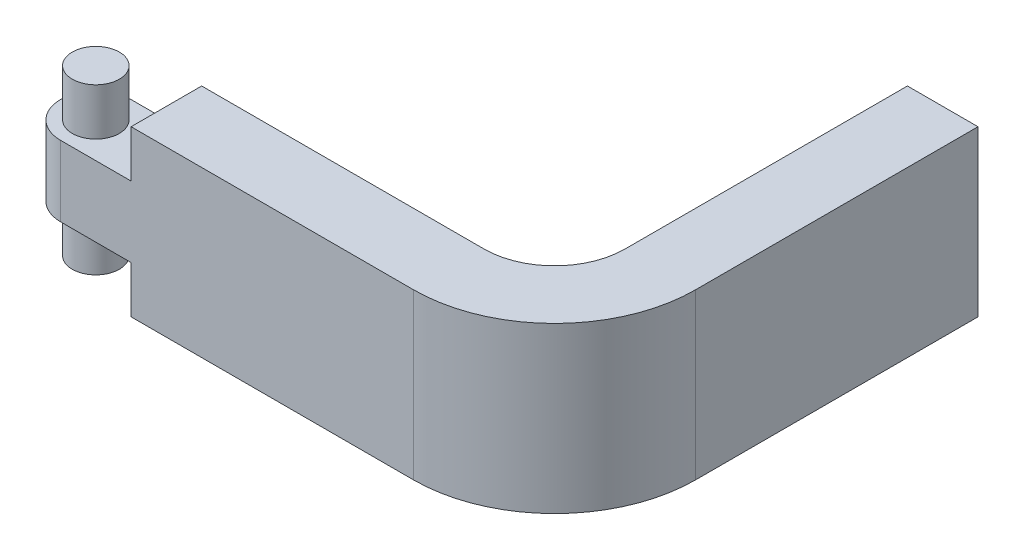
ISO-10303-21;
HEADER;
FILE_DESCRIPTION(('STEP AP214'),'2;1');
FILE_NAME('part.step','',(''),(''),'','','');
FILE_SCHEMA(('AUTOMOTIVE_DESIGN { 1 0 10303 214 1 1 1 1 }'));
ENDSEC;
DATA;
#1=APPLICATION_CONTEXT('core data for automotive mechanical design processes');
#2=APPLICATION_PROTOCOL_DEFINITION('international standard','automotive_design',2000,#1);
#3=PRODUCT_CONTEXT('',#1,'mechanical');
#4=PRODUCT('Part','Part','',(#3));
#5=PRODUCT_RELATED_PRODUCT_CATEGORY('part','',(#4));
#6=PRODUCT_DEFINITION_FORMATION('','',#4);
#7=PRODUCT_DEFINITION_CONTEXT('part definition',#1,'design');
#8=PRODUCT_DEFINITION('design','',#6,#7);
#9=PRODUCT_DEFINITION_SHAPE('','',#8);
#10=(LENGTH_UNIT() NAMED_UNIT(*) SI_UNIT(.MILLI.,.METRE.));
#11=(NAMED_UNIT(*) PLANE_ANGLE_UNIT() SI_UNIT($,.RADIAN.));
#12=(NAMED_UNIT(*) SI_UNIT($,.STERADIAN.) SOLID_ANGLE_UNIT());
#13=UNCERTAINTY_MEASURE_WITH_UNIT(LENGTH_MEASURE(1.E-05),#10,'distance_accuracy_value','');
#14=(GEOMETRIC_REPRESENTATION_CONTEXT(3) GLOBAL_UNCERTAINTY_ASSIGNED_CONTEXT((#13)) GLOBAL_UNIT_ASSIGNED_CONTEXT((#10,
#11,#12)) REPRESENTATION_CONTEXT('',''));
#15=CARTESIAN_POINT('',(0.,0.,0.));
#16=DIRECTION('',(0.,0.,1.));
#17=DIRECTION('',(1.,0.,0.));
#18=AXIS2_PLACEMENT_3D('',#15,#16,#17);
#19=CARTESIAN_POINT('',(0.,7.5,-7.5));
#20=DIRECTION('',(0.,-1.,0.));
#21=DIRECTION('',(0.,0.,-1.));
#22=AXIS2_PLACEMENT_3D('',#19,#20,#21);
#23=PLANE('',#22);
#24=CARTESIAN_POINT('',(0.,7.5,-7.5));
#25=DIRECTION('',(0.,1.,0.));
#26=DIRECTION('',(0.,0.,1.));
#27=AXIS2_PLACEMENT_3D('',#24,#25,#26);
#28=CIRCLE('',#27,5.);
#29=CARTESIAN_POINT('',(0.,7.5,-2.5));
#30=VERTEX_POINT('',#29);
#31=EDGE_CURVE('E240',#30,#30,#28,.T.);
#32=ORIENTED_EDGE('',*,*,#31,.F.);
#33=EDGE_LOOP('',(#32));
#34=FACE_BOUND('',#33,.T.);
#35=DIRECTION('',(0.,0.,1.));
#36=VECTOR('',#35,1.);
#37=CARTESIAN_POINT('',(15.0000067101923,7.5,-15.));
#38=LINE('',#37,#36);
#39=CARTESIAN_POINT('',(15.0000067101923,7.5,-15.));
#40=VERTEX_POINT('',#39);
#41=CARTESIAN_POINT('',(15.0000067101923,7.5,0.));
#42=VERTEX_POINT('',#41);
#43=EDGE_CURVE('E57',#40,#42,#38,.T.);
#44=ORIENTED_EDGE('',*,*,#43,.F.);
#45=DIRECTION('',(-1.,0.,0.));
#46=VECTOR('',#45,1.);
#47=CARTESIAN_POINT('',(0.,7.5,-15.));
#48=LINE('',#47,#46);
#49=CARTESIAN_POINT('',(0.,7.5,-15.));
#50=VERTEX_POINT('',#49);
#51=EDGE_CURVE('E249',#40,#50,#48,.T.);
#52=ORIENTED_EDGE('',*,*,#51,.T.);
#53=CARTESIAN_POINT('',(0.,7.5,-7.5));
#54=DIRECTION('',(0.,1.,0.));
#55=DIRECTION('',(0.,0.,-1.));
#56=AXIS2_PLACEMENT_3D('',#53,#54,#55);
#57=CIRCLE('',#56,7.5);
#58=CARTESIAN_POINT('',(0.,7.5,0.));
#59=VERTEX_POINT('',#58);
#60=EDGE_CURVE('E244',#50,#59,#57,.T.);
#61=ORIENTED_EDGE('',*,*,#60,.T.);
#62=DIRECTION('',(1.,0.,0.));
#63=VECTOR('',#62,1.);
#64=CARTESIAN_POINT('',(0.,7.5,0.));
#65=LINE('',#64,#63);
#66=EDGE_CURVE('E62',#59,#42,#65,.T.);
#67=ORIENTED_EDGE('',*,*,#66,.T.);
#68=EDGE_LOOP('',(#44,#52,#61,#67));
#69=FACE_BOUND('',#68,.T.);
#70=ADVANCED_FACE('F39',(#34,#69),#23,.F.);
#71=CARTESIAN_POINT('',(0.,-7.5,-7.5));
#72=DIRECTION('',(0.,1.,0.));
#73=DIRECTION('',(0.,0.,1.));
#74=AXIS2_PLACEMENT_3D('',#71,#72,#73);
#75=CYLINDRICAL_SURFACE('',#74,7.5);
#76=DIRECTION('',(0.,1.,0.));
#77=VECTOR('',#76,1.);
#78=CARTESIAN_POINT('',(0.,-7.5,0.));
#79=LINE('',#78,#77);
#80=CARTESIAN_POINT('',(0.,-7.5,0.));
#81=VERTEX_POINT('',#80);
#82=EDGE_CURVE('E43',#81,#59,#79,.T.);
#83=ORIENTED_EDGE('',*,*,#82,.T.);
#84=ORIENTED_EDGE('',*,*,#60,.F.);
#85=DIRECTION('',(0.,1.,0.));
#86=VECTOR('',#85,1.);
#87=CARTESIAN_POINT('',(0.,-7.5,-15.));
#88=LINE('',#87,#86);
#89=CARTESIAN_POINT('',(0.,-7.5,-15.));
#90=VERTEX_POINT('',#89);
#91=EDGE_CURVE('E11',#90,#50,#88,.T.);
#92=ORIENTED_EDGE('',*,*,#91,.F.);
#93=CARTESIAN_POINT('',(0.,-7.5,-7.5));
#94=DIRECTION('',(0.,1.,0.));
#95=DIRECTION('',(0.,0.,-1.));
#96=AXIS2_PLACEMENT_3D('',#93,#94,#95);
#97=CIRCLE('',#96,7.5);
#98=EDGE_CURVE('E252',#90,#81,#97,.T.);
#99=ORIENTED_EDGE('',*,*,#98,.T.);
#100=EDGE_LOOP('',(#83,#84,#92,#99));
#101=FACE_BOUND('',#100,.T.);
#102=ADVANCED_FACE('F41',(#101),#75,.T.);
#103=CARTESIAN_POINT('',(0.,-7.5,-15.));
#104=DIRECTION('',(0.,0.,-1.));
#105=DIRECTION('',(-1.,0.,0.));
#106=AXIS2_PLACEMENT_3D('',#103,#104,#105);
#107=PLANE('',#106);
#108=ORIENTED_EDGE('',*,*,#91,.T.);
#109=ORIENTED_EDGE('',*,*,#51,.F.);
#110=DIRECTION('',(0.,-1.,0.));
#111=VECTOR('',#110,1.);
#112=CARTESIAN_POINT('',(15.0000067101923,17.5,-15.));
#113=LINE('',#112,#111);
#114=CARTESIAN_POINT('',(15.0000067101923,17.5,-15.));
#115=VERTEX_POINT('',#114);
#116=EDGE_CURVE('E224',#115,#40,#113,.T.);
#117=ORIENTED_EDGE('',*,*,#116,.F.);
#118=DIRECTION('',(-1.,0.,0.));
#119=VECTOR('',#118,1.);
#120=CARTESIAN_POINT('',(75.0000067101923,17.5,-15.));
#121=LINE('',#120,#119);
#122=CARTESIAN_POINT('',(75.0000067101923,17.5,-15.));
#123=VERTEX_POINT('',#122);
#124=EDGE_CURVE('E201',#123,#115,#121,.T.);
#125=ORIENTED_EDGE('',*,*,#124,.F.);
#126=DIRECTION('',(0.,1.,0.));
#127=VECTOR('',#126,1.);
#128=CARTESIAN_POINT('',(75.0000067101923,-7.5,-15.));
#129=LINE('',#128,#127);
#130=CARTESIAN_POINT('',(75.0000067101923,-17.5,-15.));
#131=VERTEX_POINT('',#130);
#132=EDGE_CURVE('E49',#131,#123,#129,.T.);
#133=ORIENTED_EDGE('',*,*,#132,.F.);
#134=DIRECTION('',(-1.,0.,0.));
#135=VECTOR('',#134,1.);
#136=CARTESIAN_POINT('',(75.0000067101923,-17.5,-15.));
#137=LINE('',#136,#135);
#138=CARTESIAN_POINT('',(15.0000067101923,-17.5,-15.));
#139=VERTEX_POINT('',#138);
#140=EDGE_CURVE('E172',#131,#139,#137,.T.);
#141=ORIENTED_EDGE('',*,*,#140,.T.);
#142=DIRECTION('',(0.,1.,0.));
#143=VECTOR('',#142,1.);
#144=CARTESIAN_POINT('',(15.0000067101923,-17.5,-15.));
#145=LINE('',#144,#143);
#146=CARTESIAN_POINT('',(15.0000067101923,-7.5,-15.));
#147=VERTEX_POINT('',#146);
#148=EDGE_CURVE('E182',#139,#147,#145,.T.);
#149=ORIENTED_EDGE('',*,*,#148,.T.);
#150=DIRECTION('',(-1.,0.,0.));
#151=VECTOR('',#150,1.);
#152=CARTESIAN_POINT('',(0.,-7.5,-15.));
#153=LINE('',#152,#151);
#154=EDGE_CURVE('E260',#147,#90,#153,.T.);
#155=ORIENTED_EDGE('',*,*,#154,.T.);
#156=EDGE_LOOP('',(#108,#109,#117,#125,#133,#141,#149,#155));
#157=FACE_BOUND('',#156,.T.);
#158=ADVANCED_FACE('F285',(#157),#107,.T.);
#159=CARTESIAN_POINT('',(75.0000067101923,-7.5,-30.));
#160=DIRECTION('',(0.,1.,0.));
#161=DIRECTION('',(0.,0.,1.));
#162=AXIS2_PLACEMENT_3D('',#159,#160,#161);
#163=CYLINDRICAL_SURFACE('',#162,15.);
#164=ORIENTED_EDGE('',*,*,#132,.T.);
#165=CARTESIAN_POINT('',(75.0000067101923,17.5,-30.));
#166=DIRECTION('',(0.,-1.,0.));
#167=DIRECTION('',(0.,0.,-1.));
#168=AXIS2_PLACEMENT_3D('',#165,#166,#167);
#169=CIRCLE('',#168,15.);
#170=CARTESIAN_POINT('',(90.0000067101923,17.5,-30.));
#171=VERTEX_POINT('',#170);
#172=EDGE_CURVE('E197',#171,#123,#169,.T.);
#173=ORIENTED_EDGE('',*,*,#172,.F.);
#174=DIRECTION('',(0.,1.,0.));
#175=VECTOR('',#174,1.);
#176=CARTESIAN_POINT('',(90.0000067101923,-7.5,-30.));
#177=LINE('',#176,#175);
#178=CARTESIAN_POINT('',(90.0000067101923,-17.5,-30.));
#179=VERTEX_POINT('',#178);
#180=EDGE_CURVE('E265',#179,#171,#177,.T.);
#181=ORIENTED_EDGE('',*,*,#180,.F.);
#182=CARTESIAN_POINT('',(75.0000067101923,-17.5,-30.));
#183=DIRECTION('',(0.,-1.,0.));
#184=DIRECTION('',(0.,0.,-1.));
#185=AXIS2_PLACEMENT_3D('',#182,#183,#184);
#186=CIRCLE('',#185,15.);
#187=EDGE_CURVE('E176',#179,#131,#186,.T.);
#188=ORIENTED_EDGE('',*,*,#187,.T.);
#189=EDGE_LOOP('',(#164,#173,#181,#188));
#190=FACE_BOUND('',#189,.T.);
#191=ADVANCED_FACE('F298',(#190),#163,.F.);
#192=CARTESIAN_POINT('',(90.0000067101923,-7.5,-30.));
#193=DIRECTION('',(-1.,0.,0.));
#194=DIRECTION('',(0.,0.,1.));
#195=AXIS2_PLACEMENT_3D('',#192,#193,#194);
#196=PLANE('',#195);
#197=ORIENTED_EDGE('',*,*,#180,.T.);
#198=DIRECTION('',(0.,0.,1.));
#199=VECTOR('',#198,1.);
#200=CARTESIAN_POINT('',(90.0000067101923,17.5,-90.));
#201=LINE('',#200,#199);
#202=CARTESIAN_POINT('',(90.0000067101923,17.5,-90.));
#203=VERTEX_POINT('',#202);
#204=EDGE_CURVE('E193',#203,#171,#201,.T.);
#205=ORIENTED_EDGE('',*,*,#204,.F.);
#206=DIRECTION('',(0.,1.,0.));
#207=VECTOR('',#206,1.);
#208=CARTESIAN_POINT('',(90.0000067101923,-7.5,-90.));
#209=LINE('',#208,#207);
#210=CARTESIAN_POINT('',(90.0000067101923,-17.5,-90.));
#211=VERTEX_POINT('',#210);
#212=EDGE_CURVE('E142',#211,#203,#209,.T.);
#213=ORIENTED_EDGE('',*,*,#212,.F.);
#214=DIRECTION('',(0.,0.,1.));
#215=VECTOR('',#214,1.);
#216=CARTESIAN_POINT('',(90.0000067101923,-17.5,-90.));
#217=LINE('',#216,#215);
#218=EDGE_CURVE('E153',#211,#179,#217,.T.);
#219=ORIENTED_EDGE('',*,*,#218,.T.);
#220=EDGE_LOOP('',(#197,#205,#213,#219));
#221=FACE_BOUND('',#220,.T.);
#222=ADVANCED_FACE('F302',(#221),#196,.T.);
#223=CARTESIAN_POINT('',(90.0000067101923,-7.5,-90.));
#224=DIRECTION('',(0.,0.,-1.));
#225=DIRECTION('',(-1.,0.,0.));
#226=AXIS2_PLACEMENT_3D('',#223,#224,#225);
#227=PLANE('',#226);
#228=ORIENTED_EDGE('',*,*,#212,.T.);
#229=DIRECTION('',(-1.,0.,0.));
#230=VECTOR('',#229,1.);
#231=CARTESIAN_POINT('',(105.,17.5,-90.));
#232=LINE('',#231,#230);
#233=CARTESIAN_POINT('',(105.,17.5,-90.));
#234=VERTEX_POINT('',#233);
#235=EDGE_CURVE('E136',#234,#203,#232,.T.);
#236=ORIENTED_EDGE('',*,*,#235,.F.);
#237=DIRECTION('',(0.,1.,0.));
#238=VECTOR('',#237,1.);
#239=CARTESIAN_POINT('',(105.,-7.5,-90.));
#240=LINE('',#239,#238);
#241=CARTESIAN_POINT('',(105.,-17.5,-90.));
#242=VERTEX_POINT('',#241);
#243=EDGE_CURVE('E130',#242,#234,#240,.T.);
#244=ORIENTED_EDGE('',*,*,#243,.F.);
#245=DIRECTION('',(-1.,0.,0.));
#246=VECTOR('',#245,1.);
#247=CARTESIAN_POINT('',(105.,-17.5,-90.));
#248=LINE('',#247,#246);
#249=EDGE_CURVE('E133',#242,#211,#248,.T.);
#250=ORIENTED_EDGE('',*,*,#249,.T.);
#251=EDGE_LOOP('',(#228,#236,#244,#250));
#252=FACE_BOUND('',#251,.T.);
#253=ADVANCED_FACE('F132',(#252),#227,.T.);
#254=CARTESIAN_POINT('',(105.,-7.5,-30.));
#255=DIRECTION('',(1.,0.,0.));
#256=DIRECTION('',(0.,0.,-1.));
#257=AXIS2_PLACEMENT_3D('',#254,#255,#256);
#258=PLANE('',#257);
#259=ORIENTED_EDGE('',*,*,#243,.T.);
#260=DIRECTION('',(0.,0.,-1.));
#261=VECTOR('',#260,1.);
#262=CARTESIAN_POINT('',(105.,17.5,-30.));
#263=LINE('',#262,#261);
#264=CARTESIAN_POINT('',(105.,17.5,-30.));
#265=VERTEX_POINT('',#264);
#266=EDGE_CURVE('E215',#265,#234,#263,.T.);
#267=ORIENTED_EDGE('',*,*,#266,.F.);
#268=DIRECTION('',(0.,1.,0.));
#269=VECTOR('',#268,1.);
#270=CARTESIAN_POINT('',(105.,-7.5,-30.));
#271=LINE('',#270,#269);
#272=CARTESIAN_POINT('',(105.,-17.5,-30.));
#273=VERTEX_POINT('',#272);
#274=EDGE_CURVE('E143',#273,#265,#271,.T.);
#275=ORIENTED_EDGE('',*,*,#274,.F.);
#276=DIRECTION('',(0.,0.,-1.));
#277=VECTOR('',#276,1.);
#278=CARTESIAN_POINT('',(105.,-17.5,-30.));
#279=LINE('',#278,#277);
#280=EDGE_CURVE('E149',#273,#242,#279,.T.);
#281=ORIENTED_EDGE('',*,*,#280,.T.);
#282=EDGE_LOOP('',(#259,#267,#275,#281));
#283=FACE_BOUND('',#282,.T.);
#284=ADVANCED_FACE('F157',(#283),#258,.T.);
#285=CARTESIAN_POINT('',(75.,-7.5,-30.));
#286=DIRECTION('',(0.,1.,0.));
#287=DIRECTION('',(0.,0.,1.));
#288=AXIS2_PLACEMENT_3D('',#285,#286,#287);
#289=CYLINDRICAL_SURFACE('',#288,30.);
#290=ORIENTED_EDGE('',*,*,#274,.T.);
#291=CARTESIAN_POINT('',(75.,17.5,-30.));
#292=DIRECTION('',(0.,1.,0.));
#293=DIRECTION('',(0.,0.,1.));
#294=AXIS2_PLACEMENT_3D('',#291,#292,#293);
#295=CIRCLE('',#294,30.);
#296=CARTESIAN_POINT('',(75.,17.5,0.));
#297=VERTEX_POINT('',#296);
#298=EDGE_CURVE('E211',#297,#265,#295,.T.);
#299=ORIENTED_EDGE('',*,*,#298,.F.);
#300=DIRECTION('',(0.,1.,0.));
#301=VECTOR('',#300,1.);
#302=CARTESIAN_POINT('',(75.,-7.5,0.));
#303=LINE('',#302,#301);
#304=CARTESIAN_POINT('',(75.,-17.5,0.));
#305=VERTEX_POINT('',#304);
#306=EDGE_CURVE('E271',#305,#297,#303,.T.);
#307=ORIENTED_EDGE('',*,*,#306,.F.);
#308=CARTESIAN_POINT('',(75.,-17.5,-30.));
#309=DIRECTION('',(0.,1.,0.));
#310=DIRECTION('',(0.,0.,1.));
#311=AXIS2_PLACEMENT_3D('',#308,#309,#310);
#312=CIRCLE('',#311,30.);
#313=EDGE_CURVE('E159',#305,#273,#312,.T.);
#314=ORIENTED_EDGE('',*,*,#313,.T.);
#315=EDGE_LOOP('',(#290,#299,#307,#314));
#316=FACE_BOUND('',#315,.T.);
#317=ADVANCED_FACE('F307',(#316),#289,.T.);
#318=CARTESIAN_POINT('',(0.,-7.5,0.));
#319=DIRECTION('',(0.,0.,1.));
#320=DIRECTION('',(1.,0.,0.));
#321=AXIS2_PLACEMENT_3D('',#318,#319,#320);
#322=PLANE('',#321);
#323=ORIENTED_EDGE('',*,*,#306,.T.);
#324=DIRECTION('',(1.,0.,0.));
#325=VECTOR('',#324,1.);
#326=CARTESIAN_POINT('',(15.0000067101923,17.5,0.));
#327=LINE('',#326,#325);
#328=CARTESIAN_POINT('',(15.0000067101923,17.5,0.));
#329=VERTEX_POINT('',#328);
#330=EDGE_CURVE('E207',#329,#297,#327,.T.);
#331=ORIENTED_EDGE('',*,*,#330,.F.);
#332=DIRECTION('',(0.,-1.,0.));
#333=VECTOR('',#332,1.);
#334=CARTESIAN_POINT('',(15.0000067101923,17.5,0.));
#335=LINE('',#334,#333);
#336=EDGE_CURVE('E218',#329,#42,#335,.T.);
#337=ORIENTED_EDGE('',*,*,#336,.T.);
#338=ORIENTED_EDGE('',*,*,#66,.F.);
#339=ORIENTED_EDGE('',*,*,#82,.F.);
#340=DIRECTION('',(1.,0.,0.));
#341=VECTOR('',#340,1.);
#342=CARTESIAN_POINT('',(0.,-7.5,0.));
#343=LINE('',#342,#341);
#344=CARTESIAN_POINT('',(15.0000067101923,-7.5,0.));
#345=VERTEX_POINT('',#344);
#346=EDGE_CURVE('E256',#81,#345,#343,.T.);
#347=ORIENTED_EDGE('',*,*,#346,.T.);
#348=DIRECTION('',(0.,1.,0.));
#349=VECTOR('',#348,1.);
#350=CARTESIAN_POINT('',(15.0000067101923,-17.5,0.));
#351=LINE('',#350,#349);
#352=CARTESIAN_POINT('',(15.0000067101923,-17.5,0.));
#353=VERTEX_POINT('',#352);
#354=EDGE_CURVE('E188',#353,#345,#351,.T.);
#355=ORIENTED_EDGE('',*,*,#354,.F.);
#356=DIRECTION('',(1.,0.,0.));
#357=VECTOR('',#356,1.);
#358=CARTESIAN_POINT('',(15.0000067101923,-17.5,0.));
#359=LINE('',#358,#357);
#360=EDGE_CURVE('E162',#353,#305,#359,.T.);
#361=ORIENTED_EDGE('',*,*,#360,.T.);
#362=EDGE_LOOP('',(#323,#331,#337,#338,#339,#347,#355,#361));
#363=FACE_BOUND('',#362,.T.);
#364=ADVANCED_FACE('F281',(#363),#322,.T.);
#365=CARTESIAN_POINT('',(0.,-7.5,-7.5));
#366=DIRECTION('',(0.,-1.,0.));
#367=DIRECTION('',(0.,0.,-1.));
#368=AXIS2_PLACEMENT_3D('',#365,#366,#367);
#369=PLANE('',#368);
#370=DIRECTION('',(0.,0.,1.));
#371=VECTOR('',#370,1.);
#372=CARTESIAN_POINT('',(15.0000067101923,-7.5,-15.));
#373=LINE('',#372,#371);
#374=EDGE_CURVE('E155',#147,#345,#373,.T.);
#375=ORIENTED_EDGE('',*,*,#374,.T.);
#376=ORIENTED_EDGE('',*,*,#346,.F.);
#377=ORIENTED_EDGE('',*,*,#98,.F.);
#378=ORIENTED_EDGE('',*,*,#154,.F.);
#379=EDGE_LOOP('',(#375,#376,#377,#378));
#380=FACE_BOUND('',#379,.T.);
#381=CARTESIAN_POINT('',(0.,-7.5,-7.5));
#382=DIRECTION('',(0.,-1.,0.));
#383=DIRECTION('',(0.,0.,-1.));
#384=AXIS2_PLACEMENT_3D('',#381,#382,#383);
#385=CIRCLE('',#384,5.);
#386=CARTESIAN_POINT('',(0.,-7.5,-12.5));
#387=VERTEX_POINT('',#386);
#388=EDGE_CURVE('E233',#387,#387,#385,.T.);
#389=ORIENTED_EDGE('',*,*,#388,.F.);
#390=EDGE_LOOP('',(#389));
#391=FACE_BOUND('',#390,.T.);
#392=ADVANCED_FACE('F288',(#380,#391),#369,.T.);
#393=CARTESIAN_POINT('',(0.,17.5,-7.5));
#394=DIRECTION('',(0.,1.,0.));
#395=DIRECTION('',(0.,0.,1.));
#396=AXIS2_PLACEMENT_3D('',#393,#394,#395);
#397=PLANE('',#396);
#398=CARTESIAN_POINT('',(0.,17.5,-7.5));
#399=DIRECTION('',(0.,1.,0.));
#400=DIRECTION('',(0.,0.,1.));
#401=AXIS2_PLACEMENT_3D('',#398,#399,#400);
#402=CIRCLE('',#401,5.);
#403=CARTESIAN_POINT('',(0.,17.5,-2.5));
#404=VERTEX_POINT('',#403);
#405=EDGE_CURVE('E228',#404,#404,#402,.T.);
#406=ORIENTED_EDGE('',*,*,#405,.T.);
#407=EDGE_LOOP('',(#406));
#408=FACE_BOUND('',#407,.T.);
#409=ADVANCED_FACE('F328',(#408),#397,.T.);
#410=CARTESIAN_POINT('',(0.,-17.5,-7.5));
#411=DIRECTION('',(0.,1.,0.));
#412=DIRECTION('',(0.,0.,1.));
#413=AXIS2_PLACEMENT_3D('',#410,#411,#412);
#414=CYLINDRICAL_SURFACE('',#413,5.);
#415=ORIENTED_EDGE('',*,*,#405,.F.);
#416=EDGE_LOOP('',(#415));
#417=FACE_BOUND('',#416,.T.);
#418=ORIENTED_EDGE('',*,*,#31,.T.);
#419=EDGE_LOOP('',(#418));
#420=FACE_BOUND('',#419,.T.);
#421=ADVANCED_FACE('F396',(#417,#420),#414,.T.);
#422=ORIENTED_EDGE('',*,*,#388,.T.);
#423=EDGE_LOOP('',(#422));
#424=FACE_BOUND('',#423,.T.);
#425=CARTESIAN_POINT('',(0.,-17.5,-7.5));
#426=DIRECTION('',(0.,1.,0.));
#427=DIRECTION('',(0.,0.,1.));
#428=AXIS2_PLACEMENT_3D('',#425,#426,#427);
#429=CIRCLE('',#428,5.);
#430=CARTESIAN_POINT('',(0.,-17.5,-2.5));
#431=VERTEX_POINT('',#430);
#432=EDGE_CURVE('E229',#431,#431,#429,.T.);
#433=ORIENTED_EDGE('',*,*,#432,.T.);
#434=EDGE_LOOP('',(#433));
#435=FACE_BOUND('',#434,.T.);
#436=ADVANCED_FACE('F324',(#424,#435),#414,.T.);
#437=CARTESIAN_POINT('',(0.,-17.5,-7.5));
#438=DIRECTION('',(0.,1.,0.));
#439=DIRECTION('',(0.,0.,1.));
#440=AXIS2_PLACEMENT_3D('',#437,#438,#439);
#441=PLANE('',#440);
#442=ORIENTED_EDGE('',*,*,#432,.F.);
#443=EDGE_LOOP('',(#442));
#444=FACE_BOUND('',#443,.T.);
#445=ADVANCED_FACE('F392',(#444),#441,.F.);
#446=CARTESIAN_POINT('',(15.0000067101923,17.5,-15.));
#447=DIRECTION('',(1.,0.,0.));
#448=DIRECTION('',(0.,0.,-1.));
#449=AXIS2_PLACEMENT_3D('',#446,#447,#448);
#450=PLANE('',#449);
#451=ORIENTED_EDGE('',*,*,#43,.T.);
#452=ORIENTED_EDGE('',*,*,#336,.F.);
#453=DIRECTION('',(0.,0.,1.));
#454=VECTOR('',#453,1.);
#455=CARTESIAN_POINT('',(15.0000067101923,17.5,-15.));
#456=LINE('',#455,#454);
#457=EDGE_CURVE('E204',#115,#329,#456,.T.);
#458=ORIENTED_EDGE('',*,*,#457,.F.);
#459=ORIENTED_EDGE('',*,*,#116,.T.);
#460=EDGE_LOOP('',(#451,#452,#458,#459));
#461=FACE_BOUND('',#460,.T.);
#462=ADVANCED_FACE('F389',(#461),#450,.F.);
#463=CARTESIAN_POINT('',(75.0000067101923,17.5,-30.));
#464=DIRECTION('',(0.,-1.,0.));
#465=DIRECTION('',(0.,0.,-1.));
#466=AXIS2_PLACEMENT_3D('',#463,#464,#465);
#467=PLANE('',#466);
#468=ORIENTED_EDGE('',*,*,#235,.T.);
#469=ORIENTED_EDGE('',*,*,#204,.T.);
#470=ORIENTED_EDGE('',*,*,#172,.T.);
#471=ORIENTED_EDGE('',*,*,#124,.T.);
#472=ORIENTED_EDGE('',*,*,#457,.T.);
#473=ORIENTED_EDGE('',*,*,#330,.T.);
#474=ORIENTED_EDGE('',*,*,#298,.T.);
#475=ORIENTED_EDGE('',*,*,#266,.T.);
#476=EDGE_LOOP('',(#468,#469,#470,#471,#472,#473,#474,#475));
#477=FACE_BOUND('',#476,.T.);
#478=ADVANCED_FACE('F304',(#477),#467,.F.);
#479=CARTESIAN_POINT('',(15.0000067101923,-17.5,-15.));
#480=DIRECTION('',(-1.,0.,0.));
#481=DIRECTION('',(0.,0.,1.));
#482=AXIS2_PLACEMENT_3D('',#479,#480,#481);
#483=PLANE('',#482);
#484=ORIENTED_EDGE('',*,*,#374,.F.);
#485=ORIENTED_EDGE('',*,*,#148,.F.);
#486=DIRECTION('',(0.,0.,1.));
#487=VECTOR('',#486,1.);
#488=CARTESIAN_POINT('',(15.0000067101923,-17.5,-15.));
#489=LINE('',#488,#487);
#490=EDGE_CURVE('E168',#139,#353,#489,.T.);
#491=ORIENTED_EDGE('',*,*,#490,.T.);
#492=ORIENTED_EDGE('',*,*,#354,.T.);
#493=EDGE_LOOP('',(#484,#485,#491,#492));
#494=FACE_BOUND('',#493,.T.);
#495=ADVANCED_FACE('F295',(#494),#483,.T.);
#496=CARTESIAN_POINT('',(75.0000067101923,-17.5,-30.));
#497=DIRECTION('',(0.,1.,0.));
#498=DIRECTION('',(0.,0.,-1.));
#499=AXIS2_PLACEMENT_3D('',#496,#497,#498);
#500=PLANE('',#499);
#501=ORIENTED_EDGE('',*,*,#249,.F.);
#502=ORIENTED_EDGE('',*,*,#280,.F.);
#503=ORIENTED_EDGE('',*,*,#313,.F.);
#504=ORIENTED_EDGE('',*,*,#360,.F.);
#505=ORIENTED_EDGE('',*,*,#490,.F.);
#506=ORIENTED_EDGE('',*,*,#140,.F.);
#507=ORIENTED_EDGE('',*,*,#187,.F.);
#508=ORIENTED_EDGE('',*,*,#218,.F.);
#509=EDGE_LOOP('',(#501,#502,#503,#504,#505,#506,#507,#508));
#510=FACE_BOUND('',#509,.T.);
#511=ADVANCED_FACE('F147',(#510),#500,.F.);
#512=CLOSED_SHELL('',(#70,#102,#158,#191,#222,#253,#284,#317,#364,#392,#409,#421,#436,#445,#462,
#478,#495,#511));
#513=MANIFOLD_SOLID_BREP('B2',#512);
#514=ADVANCED_BREP_SHAPE_REPRESENTATION('',(#18,#513),#14);
#515=SHAPE_DEFINITION_REPRESENTATION(#9,#514);
ENDSEC;
END-ISO-10303-21;
